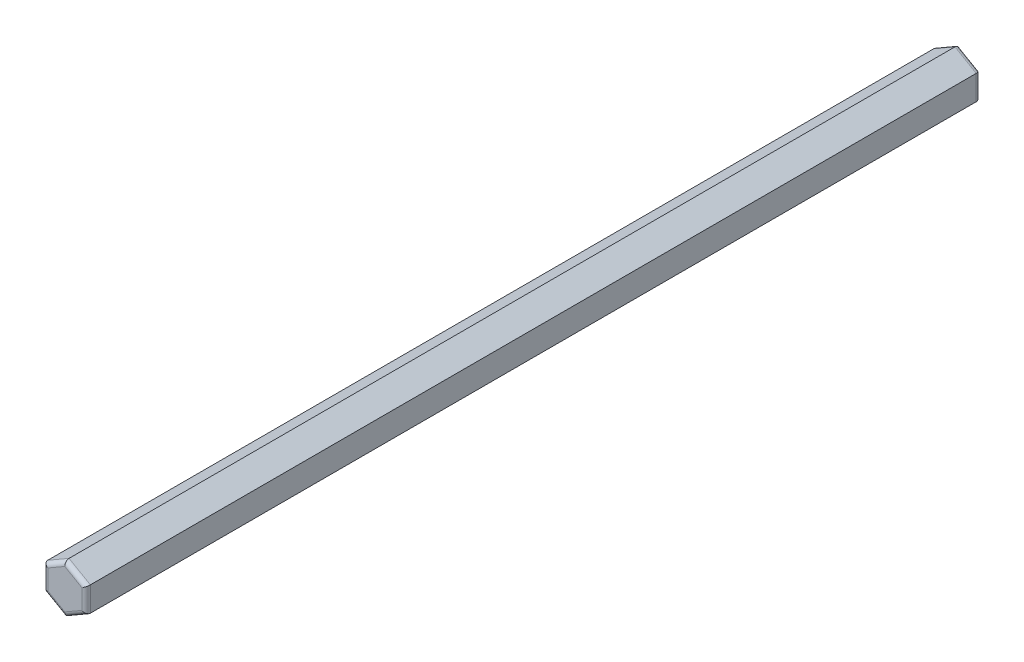
ISO-10303-21;
HEADER;
FILE_DESCRIPTION(('STEP AP214'),'2;1');
FILE_NAME('part.step','',(''),(''),'','','');
FILE_SCHEMA(('AUTOMOTIVE_DESIGN { 1 0 10303 214 1 1 1 1 }'));
ENDSEC;
DATA;
#1=APPLICATION_CONTEXT('core data for automotive mechanical design processes');
#2=APPLICATION_PROTOCOL_DEFINITION('international standard','automotive_design',2000,#1);
#3=PRODUCT_CONTEXT('',#1,'mechanical');
#4=PRODUCT('Part','Part','',(#3));
#5=PRODUCT_RELATED_PRODUCT_CATEGORY('part','',(#4));
#6=PRODUCT_DEFINITION_FORMATION('','',#4);
#7=PRODUCT_DEFINITION_CONTEXT('part definition',#1,'design');
#8=PRODUCT_DEFINITION('design','',#6,#7);
#9=PRODUCT_DEFINITION_SHAPE('','',#8);
#10=(LENGTH_UNIT() NAMED_UNIT(*) SI_UNIT(.MILLI.,.METRE.));
#11=(NAMED_UNIT(*) PLANE_ANGLE_UNIT() SI_UNIT($,.RADIAN.));
#12=(NAMED_UNIT(*) SI_UNIT($,.STERADIAN.) SOLID_ANGLE_UNIT());
#13=UNCERTAINTY_MEASURE_WITH_UNIT(LENGTH_MEASURE(1.E-05),#10,'distance_accuracy_value','');
#14=(GEOMETRIC_REPRESENTATION_CONTEXT(3) GLOBAL_UNCERTAINTY_ASSIGNED_CONTEXT((#13)) GLOBAL_UNIT_ASSIGNED_CONTEXT((#10,
#11,#12)) REPRESENTATION_CONTEXT('',''));
#15=CARTESIAN_POINT('',(0.,0.,0.));
#16=DIRECTION('',(0.,0.,1.));
#17=DIRECTION('',(1.,0.,0.));
#18=AXIS2_PLACEMENT_3D('',#15,#16,#17);
#19=CARTESIAN_POINT('',(-52.50212267549,1.44337567297407,30.));
#20=DIRECTION('',(0.5,0.866025403784439,0.));
#21=DIRECTION('',(-0.866025403784439,0.5,0.));
#22=AXIS2_PLACEMENT_3D('',#19,#20,#21);
#23=PLANE('',#22);
#24=DIRECTION('',(0.,0.,1.));
#25=VECTOR('',#24,1.);
#26=CARTESIAN_POINT('',(-55.00212267549,2.88675134594813,30.));
#27=LINE('',#26,#25);
#28=CARTESIAN_POINT('',(-55.00212267549,2.88675134594813,30.5));
#29=VERTEX_POINT('',#28);
#30=CARTESIAN_POINT('',(-55.00212267549,2.88675134594813,134.5));
#31=VERTEX_POINT('',#30);
#32=EDGE_CURVE('E153',#29,#31,#27,.T.);
#33=ORIENTED_EDGE('',*,*,#32,.T.);
#34=DIRECTION('',(-0.866025403784439,0.5,0.));
#35=VECTOR('',#34,1.);
#36=CARTESIAN_POINT('',(-52.50212267549,1.44337567297407,134.5));
#37=LINE('',#36,#35);
#38=CARTESIAN_POINT('',(-52.50212267549,1.44337567297407,134.5));
#39=VERTEX_POINT('',#38);
#40=EDGE_CURVE('E150',#31,#39,#37,.F.);
#41=ORIENTED_EDGE('',*,*,#40,.T.);
#42=DIRECTION('',(0.,0.,1.));
#43=VECTOR('',#42,1.);
#44=CARTESIAN_POINT('',(-52.50212267549,1.44337567297407,30.));
#45=LINE('',#44,#43);
#46=CARTESIAN_POINT('',(-52.50212267549,1.44337567297407,30.5));
#47=VERTEX_POINT('',#46);
#48=EDGE_CURVE('E147',#47,#39,#45,.T.);
#49=ORIENTED_EDGE('',*,*,#48,.F.);
#50=DIRECTION('',(-0.866025403784439,0.5,0.));
#51=VECTOR('',#50,1.);
#52=CARTESIAN_POINT('',(-55.00212267549,2.88675134594813,30.5));
#53=LINE('',#52,#51);
#54=EDGE_CURVE('E206',#47,#29,#53,.T.);
#55=ORIENTED_EDGE('',*,*,#54,.T.);
#56=EDGE_LOOP('',(#33,#41,#49,#55));
#57=FACE_BOUND('',#56,.T.);
#58=ADVANCED_FACE('F33',(#57),#23,.T.);
#59=CARTESIAN_POINT('',(-52.50212267549,-1.44337567297408,30.));
#60=DIRECTION('',(1.,0.,0.));
#61=DIRECTION('',(0.,0.,-1.));
#62=AXIS2_PLACEMENT_3D('',#59,#60,#61);
#63=PLANE('',#62);
#64=ORIENTED_EDGE('',*,*,#48,.T.);
#65=DIRECTION('',(0.,1.,0.));
#66=VECTOR('',#65,1.);
#67=CARTESIAN_POINT('',(-52.50212267549,-1.44337567297408,134.5));
#68=LINE('',#67,#66);
#69=CARTESIAN_POINT('',(-52.50212267549,-1.44337567297408,134.5));
#70=VERTEX_POINT('',#69);
#71=EDGE_CURVE('E191',#39,#70,#68,.F.);
#72=ORIENTED_EDGE('',*,*,#71,.T.);
#73=DIRECTION('',(0.,0.,1.));
#74=VECTOR('',#73,1.);
#75=CARTESIAN_POINT('',(-52.50212267549,-1.44337567297408,30.));
#76=LINE('',#75,#74);
#77=CARTESIAN_POINT('',(-52.50212267549,-1.44337567297408,30.5));
#78=VERTEX_POINT('',#77);
#79=EDGE_CURVE('E255',#78,#70,#76,.T.);
#80=ORIENTED_EDGE('',*,*,#79,.F.);
#81=DIRECTION('',(0.,1.,0.));
#82=VECTOR('',#81,1.);
#83=CARTESIAN_POINT('',(-52.50212267549,1.44337567297407,30.5));
#84=LINE('',#83,#82);
#85=EDGE_CURVE('E197',#78,#47,#84,.T.);
#86=ORIENTED_EDGE('',*,*,#85,.T.);
#87=EDGE_LOOP('',(#64,#72,#80,#86));
#88=FACE_BOUND('',#87,.T.);
#89=ADVANCED_FACE('F258',(#88),#63,.T.);
#90=CARTESIAN_POINT('',(-55.00212267549,-2.88675134594813,30.));
#91=DIRECTION('',(0.5,-0.866025403784439,0.));
#92=DIRECTION('',(0.866025403784439,0.5,0.));
#93=AXIS2_PLACEMENT_3D('',#90,#91,#92);
#94=PLANE('',#93);
#95=ORIENTED_EDGE('',*,*,#79,.T.);
#96=DIRECTION('',(0.866025403784439,0.5,0.));
#97=VECTOR('',#96,1.);
#98=CARTESIAN_POINT('',(-55.00212267549,-2.88675134594813,134.5));
#99=LINE('',#98,#97);
#100=CARTESIAN_POINT('',(-55.00212267549,-2.88675134594813,134.5));
#101=VERTEX_POINT('',#100);
#102=EDGE_CURVE('E231',#70,#101,#99,.F.);
#103=ORIENTED_EDGE('',*,*,#102,.T.);
#104=DIRECTION('',(0.,0.,1.));
#105=VECTOR('',#104,1.);
#106=CARTESIAN_POINT('',(-55.00212267549,-2.88675134594813,30.));
#107=LINE('',#106,#105);
#108=CARTESIAN_POINT('',(-55.00212267549,-2.88675134594813,30.5));
#109=VERTEX_POINT('',#108);
#110=EDGE_CURVE('E253',#109,#101,#107,.T.);
#111=ORIENTED_EDGE('',*,*,#110,.F.);
#112=DIRECTION('',(0.866025403784439,0.5,0.));
#113=VECTOR('',#112,1.);
#114=CARTESIAN_POINT('',(-52.50212267549,-1.44337567297408,30.5));
#115=LINE('',#114,#113);
#116=EDGE_CURVE('E234',#109,#78,#115,.T.);
#117=ORIENTED_EDGE('',*,*,#116,.T.);
#118=EDGE_LOOP('',(#95,#103,#111,#117));
#119=FACE_BOUND('',#118,.T.);
#120=ADVANCED_FACE('F269',(#119),#94,.T.);
#121=CARTESIAN_POINT('',(-57.50212267549,-1.44337567297406,30.));
#122=DIRECTION('',(-0.5,-0.866025403784438,0.));
#123=DIRECTION('',(0.866025403784438,-0.5,0.));
#124=AXIS2_PLACEMENT_3D('',#121,#122,#123);
#125=PLANE('',#124);
#126=ORIENTED_EDGE('',*,*,#110,.T.);
#127=DIRECTION('',(0.866025403784438,-0.5,0.));
#128=VECTOR('',#127,1.);
#129=CARTESIAN_POINT('',(-57.50212267549,-1.44337567297406,134.5));
#130=LINE('',#129,#128);
#131=CARTESIAN_POINT('',(-57.50212267549,-1.44337567297406,134.5));
#132=VERTEX_POINT('',#131);
#133=EDGE_CURVE('E201',#101,#132,#130,.F.);
#134=ORIENTED_EDGE('',*,*,#133,.T.);
#135=DIRECTION('',(0.,0.,1.));
#136=VECTOR('',#135,1.);
#137=CARTESIAN_POINT('',(-57.50212267549,-1.44337567297406,30.));
#138=LINE('',#137,#136);
#139=CARTESIAN_POINT('',(-57.50212267549,-1.44337567297406,30.5));
#140=VERTEX_POINT('',#139);
#141=EDGE_CURVE('E250',#140,#132,#138,.T.);
#142=ORIENTED_EDGE('',*,*,#141,.F.);
#143=DIRECTION('',(0.866025403784438,-0.5,0.));
#144=VECTOR('',#143,1.);
#145=CARTESIAN_POINT('',(-55.00212267549,-2.88675134594813,30.5));
#146=LINE('',#145,#144);
#147=EDGE_CURVE('E226',#140,#109,#146,.T.);
#148=ORIENTED_EDGE('',*,*,#147,.T.);
#149=EDGE_LOOP('',(#126,#134,#142,#148));
#150=FACE_BOUND('',#149,.T.);
#151=ADVANCED_FACE('F270',(#150),#125,.T.);
#152=CARTESIAN_POINT('',(-57.50212267549,1.44337567297406,30.));
#153=DIRECTION('',(-1.,0.,0.));
#154=DIRECTION('',(0.,0.,1.));
#155=AXIS2_PLACEMENT_3D('',#152,#153,#154);
#156=PLANE('',#155);
#157=ORIENTED_EDGE('',*,*,#141,.T.);
#158=DIRECTION('',(0.,-1.,0.));
#159=VECTOR('',#158,1.);
#160=CARTESIAN_POINT('',(-57.50212267549,1.44337567297406,134.5));
#161=LINE('',#160,#159);
#162=CARTESIAN_POINT('',(-57.50212267549,1.44337567297406,134.5));
#163=VERTEX_POINT('',#162);
#164=EDGE_CURVE('E199',#132,#163,#161,.F.);
#165=ORIENTED_EDGE('',*,*,#164,.T.);
#166=DIRECTION('',(0.,0.,1.));
#167=VECTOR('',#166,1.);
#168=CARTESIAN_POINT('',(-57.50212267549,1.44337567297406,30.));
#169=LINE('',#168,#167);
#170=CARTESIAN_POINT('',(-57.50212267549,1.44337567297406,30.5));
#171=VERTEX_POINT('',#170);
#172=EDGE_CURVE('E247',#171,#163,#169,.T.);
#173=ORIENTED_EDGE('',*,*,#172,.F.);
#174=DIRECTION('',(0.,-1.,0.));
#175=VECTOR('',#174,1.);
#176=CARTESIAN_POINT('',(-57.50212267549,-1.44337567297406,30.5));
#177=LINE('',#176,#175);
#178=EDGE_CURVE('E196',#171,#140,#177,.T.);
#179=ORIENTED_EDGE('',*,*,#178,.T.);
#180=EDGE_LOOP('',(#157,#165,#173,#179));
#181=FACE_BOUND('',#180,.T.);
#182=ADVANCED_FACE('F276',(#181),#156,.T.);
#183=CARTESIAN_POINT('',(-55.00212267549,2.88675134594813,30.));
#184=DIRECTION('',(-0.5,0.866025403784439,0.));
#185=DIRECTION('',(-0.866025403784439,-0.5,0.));
#186=AXIS2_PLACEMENT_3D('',#183,#184,#185);
#187=PLANE('',#186);
#188=ORIENTED_EDGE('',*,*,#172,.T.);
#189=DIRECTION('',(-0.866025403784439,-0.5,0.));
#190=VECTOR('',#189,1.);
#191=CARTESIAN_POINT('',(-55.00212267549,2.88675134594813,134.5));
#192=LINE('',#191,#190);
#193=EDGE_CURVE('E211',#163,#31,#192,.F.);
#194=ORIENTED_EDGE('',*,*,#193,.T.);
#195=ORIENTED_EDGE('',*,*,#32,.F.);
#196=DIRECTION('',(-0.866025403784439,-0.5,0.));
#197=VECTOR('',#196,1.);
#198=CARTESIAN_POINT('',(-57.50212267549,1.44337567297406,30.5));
#199=LINE('',#198,#197);
#200=EDGE_CURVE('E209',#29,#171,#199,.T.);
#201=ORIENTED_EDGE('',*,*,#200,.T.);
#202=EDGE_LOOP('',(#188,#194,#195,#201));
#203=FACE_BOUND('',#202,.T.);
#204=ADVANCED_FACE('F299',(#203),#187,.T.);
#205=CARTESIAN_POINT('',(0.,0.,30.));
#206=DIRECTION('',(0.,0.,1.));
#207=DIRECTION('',(1.,0.,0.));
#208=AXIS2_PLACEMENT_3D('',#205,#206,#207);
#209=PLANE('',#208);
#210=DIRECTION('',(0.,1.,0.));
#211=VECTOR('',#210,1.);
#212=CARTESIAN_POINT('',(-53.00212267549,-1.44337567297408,30.));
#213=LINE('',#212,#211);
#214=CARTESIAN_POINT('',(-53.00212267549,1.15470053837925,30.));
#215=VERTEX_POINT('',#214);
#216=CARTESIAN_POINT('',(-53.00212267549,-1.15470053837926,30.));
#217=VERTEX_POINT('',#216);
#218=EDGE_CURVE('E57',#215,#217,#213,.F.);
#219=ORIENTED_EDGE('',*,*,#218,.T.);
#220=DIRECTION('',(0.866025403784439,0.5,0.));
#221=VECTOR('',#220,1.);
#222=CARTESIAN_POINT('',(-55.25212267549,-2.45373864405591,30.));
#223=LINE('',#222,#221);
#224=CARTESIAN_POINT('',(-55.00212267549,-2.30940107675851,30.));
#225=VERTEX_POINT('',#224);
#226=EDGE_CURVE('E11',#217,#225,#223,.F.);
#227=ORIENTED_EDGE('',*,*,#226,.T.);
#228=DIRECTION('',(0.866025403784438,-0.5,0.));
#229=VECTOR('',#228,1.);
#230=CARTESIAN_POINT('',(-57.25212267549,-1.01036297108184,30.));
#231=LINE('',#230,#229);
#232=CARTESIAN_POINT('',(-57.00212267549,-1.15470053837925,30.));
#233=VERTEX_POINT('',#232);
#234=EDGE_CURVE('E42',#225,#233,#231,.F.);
#235=ORIENTED_EDGE('',*,*,#234,.T.);
#236=DIRECTION('',(0.,-1.,0.));
#237=VECTOR('',#236,1.);
#238=CARTESIAN_POINT('',(-57.00212267549,1.44337567297406,30.));
#239=LINE('',#238,#237);
#240=CARTESIAN_POINT('',(-57.00212267549,1.15470053837925,30.));
#241=VERTEX_POINT('',#240);
#242=EDGE_CURVE('E217',#233,#241,#239,.F.);
#243=ORIENTED_EDGE('',*,*,#242,.T.);
#244=DIRECTION('',(-0.866025403784439,-0.5,0.));
#245=VECTOR('',#244,1.);
#246=CARTESIAN_POINT('',(-54.75212267549,2.45373864405591,30.));
#247=LINE('',#246,#245);
#248=CARTESIAN_POINT('',(-55.00212267549,2.3094010767585,30.));
#249=VERTEX_POINT('',#248);
#250=EDGE_CURVE('E213',#241,#249,#247,.F.);
#251=ORIENTED_EDGE('',*,*,#250,.T.);
#252=DIRECTION('',(-0.866025403784439,0.5,0.));
#253=VECTOR('',#252,1.);
#254=CARTESIAN_POINT('',(-52.75212267549,1.01036297108185,30.));
#255=LINE('',#254,#253);
#256=EDGE_CURVE('E215',#249,#215,#255,.F.);
#257=ORIENTED_EDGE('',*,*,#256,.T.);
#258=EDGE_LOOP('',(#219,#227,#235,#243,#251,#257));
#259=FACE_BOUND('',#258,.T.);
#260=ADVANCED_FACE('F219',(#259),#209,.F.);
#261=CARTESIAN_POINT('',(0.,0.,135.));
#262=DIRECTION('',(0.,0.,1.));
#263=DIRECTION('',(1.,0.,0.));
#264=AXIS2_PLACEMENT_3D('',#261,#262,#263);
#265=PLANE('',#264);
#266=DIRECTION('',(0.866025403784438,-0.5,0.));
#267=VECTOR('',#266,1.);
#268=CARTESIAN_POINT('',(-14.7505306688725,-25.5486685570901,135.));
#269=LINE('',#268,#267);
#270=CARTESIAN_POINT('',(-57.00212267549,-1.15470053837926,135.));
#271=VERTEX_POINT('',#270);
#272=CARTESIAN_POINT('',(-55.00212267549,-2.30940107675851,135.));
#273=VERTEX_POINT('',#272);
#274=EDGE_CURVE('E241',#271,#273,#269,.T.);
#275=ORIENTED_EDGE('',*,*,#274,.T.);
#276=DIRECTION('',(0.866025403784439,0.5,0.));
#277=VECTOR('',#276,1.);
#278=CARTESIAN_POINT('',(-12.7505306688725,22.0845669419523,135.));
#279=LINE('',#278,#277);
#280=CARTESIAN_POINT('',(-53.00212267549,-1.15470053837926,135.));
#281=VERTEX_POINT('',#280);
#282=EDGE_CURVE('E239',#273,#281,#279,.T.);
#283=ORIENTED_EDGE('',*,*,#282,.T.);
#284=DIRECTION('',(0.,1.,0.));
#285=VECTOR('',#284,1.);
#286=CARTESIAN_POINT('',(-53.00212267549,0.,135.));
#287=LINE('',#286,#285);
#288=CARTESIAN_POINT('',(-53.00212267549,1.15470053837925,135.));
#289=VERTEX_POINT('',#288);
#290=EDGE_CURVE('E131',#281,#289,#287,.T.);
#291=ORIENTED_EDGE('',*,*,#290,.T.);
#292=DIRECTION('',(-0.866025403784439,0.5,0.));
#293=VECTOR('',#292,1.);
#294=CARTESIAN_POINT('',(-12.7505306688725,-22.0845669419524,135.));
#295=LINE('',#294,#293);
#296=CARTESIAN_POINT('',(-55.00212267549,2.3094010767585,135.));
#297=VERTEX_POINT('',#296);
#298=EDGE_CURVE('E124',#289,#297,#295,.T.);
#299=ORIENTED_EDGE('',*,*,#298,.T.);
#300=DIRECTION('',(-0.866025403784439,-0.5,0.));
#301=VECTOR('',#300,1.);
#302=CARTESIAN_POINT('',(-14.7505306688725,25.5486685570901,135.));
#303=LINE('',#302,#301);
#304=CARTESIAN_POINT('',(-57.00212267549,1.15470053837924,135.));
#305=VERTEX_POINT('',#304);
#306=EDGE_CURVE('E127',#297,#305,#303,.T.);
#307=ORIENTED_EDGE('',*,*,#306,.T.);
#308=DIRECTION('',(0.,-1.,0.));
#309=VECTOR('',#308,1.);
#310=CARTESIAN_POINT('',(-57.00212267549,0.,135.));
#311=LINE('',#310,#309);
#312=EDGE_CURVE('E136',#305,#271,#311,.T.);
#313=ORIENTED_EDGE('',*,*,#312,.T.);
#314=EDGE_LOOP('',(#275,#283,#291,#299,#307,#313));
#315=FACE_BOUND('',#314,.T.);
#316=ADVANCED_FACE('F126',(#315),#265,.T.);
#317=CARTESIAN_POINT('',(-14.7505306688725,25.5486685570901,134.5));
#318=DIRECTION('',(-0.866025403784439,-0.5,0.));
#319=DIRECTION('',(0.5,-0.866025403784439,0.));
#320=AXIS2_PLACEMENT_3D('',#317,#318,#319);
#321=CYLINDRICAL_SURFACE('',#320,0.5);
#322=CARTESIAN_POINT('',(-55.00212267549,2.3094010767585,134.5));
#323=DIRECTION('',(-1.,0.,0.));
#324=DIRECTION('',(0.,-1.,0.));
#325=AXIS2_PLACEMENT_3D('',#322,#323,#324);
#326=ELLIPSE('',#325,0.577350269189626,0.5);
#327=EDGE_CURVE('E142',#31,#297,#326,.F.);
#328=ORIENTED_EDGE('',*,*,#327,.F.);
#329=ORIENTED_EDGE('',*,*,#193,.F.);
#330=CARTESIAN_POINT('',(-57.00212267549,1.15470053837924,134.5));
#331=DIRECTION('',(-0.5,-0.866025403784439,0.));
#332=DIRECTION('',(-0.866025403784439,0.5,0.));
#333=AXIS2_PLACEMENT_3D('',#330,#331,#332);
#334=ELLIPSE('',#333,0.577350269189626,0.5);
#335=EDGE_CURVE('E145',#305,#163,#334,.T.);
#336=ORIENTED_EDGE('',*,*,#335,.F.);
#337=ORIENTED_EDGE('',*,*,#306,.F.);
#338=EDGE_LOOP('',(#328,#329,#336,#337));
#339=FACE_BOUND('',#338,.T.);
#340=ADVANCED_FACE('F140',(#339),#321,.T.);
#341=CARTESIAN_POINT('',(-57.00212267549,0.,134.5));
#342=DIRECTION('',(0.,-1.,0.));
#343=DIRECTION('',(0.,0.,-1.));
#344=AXIS2_PLACEMENT_3D('',#341,#342,#343);
#345=CYLINDRICAL_SURFACE('',#344,0.5);
#346=ORIENTED_EDGE('',*,*,#335,.T.);
#347=ORIENTED_EDGE('',*,*,#164,.F.);
#348=CARTESIAN_POINT('',(-57.00212267549,-1.15470053837925,134.5));
#349=DIRECTION('',(0.5,-0.866025403784439,0.));
#350=DIRECTION('',(-0.866025403784439,-0.5,0.));
#351=AXIS2_PLACEMENT_3D('',#348,#349,#350);
#352=ELLIPSE('',#351,0.577350269189626,0.5);
#353=EDGE_CURVE('E151',#271,#132,#352,.T.);
#354=ORIENTED_EDGE('',*,*,#353,.F.);
#355=ORIENTED_EDGE('',*,*,#312,.F.);
#356=EDGE_LOOP('',(#346,#347,#354,#355));
#357=FACE_BOUND('',#356,.T.);
#358=ADVANCED_FACE('F280',(#357),#345,.T.);
#359=CARTESIAN_POINT('',(-12.7505306688725,-22.0845669419524,134.5));
#360=DIRECTION('',(-0.866025403784439,0.5,0.));
#361=DIRECTION('',(-0.5,-0.866025403784439,0.));
#362=AXIS2_PLACEMENT_3D('',#359,#360,#361);
#363=CYLINDRICAL_SURFACE('',#362,0.5);
#364=ORIENTED_EDGE('',*,*,#327,.T.);
#365=ORIENTED_EDGE('',*,*,#298,.F.);
#366=CARTESIAN_POINT('',(-53.00212267549,1.15470053837925,134.5));
#367=DIRECTION('',(-0.5,0.866025403784439,0.));
#368=DIRECTION('',(-0.866025403784439,-0.5,0.));
#369=AXIS2_PLACEMENT_3D('',#366,#367,#368);
#370=ELLIPSE('',#369,0.577350269189626,0.5);
#371=EDGE_CURVE('E156',#39,#289,#370,.F.);
#372=ORIENTED_EDGE('',*,*,#371,.F.);
#373=ORIENTED_EDGE('',*,*,#40,.F.);
#374=EDGE_LOOP('',(#364,#365,#372,#373));
#375=FACE_BOUND('',#374,.T.);
#376=ADVANCED_FACE('F149',(#375),#363,.T.);
#377=CARTESIAN_POINT('',(-14.7505306688725,-25.5486685570901,134.5));
#378=DIRECTION('',(0.866025403784438,-0.5,0.));
#379=DIRECTION('',(0.5,0.866025403784438,0.));
#380=AXIS2_PLACEMENT_3D('',#377,#378,#379);
#381=CYLINDRICAL_SURFACE('',#380,0.5);
#382=ORIENTED_EDGE('',*,*,#353,.T.);
#383=ORIENTED_EDGE('',*,*,#133,.F.);
#384=CARTESIAN_POINT('',(-55.00212267549,-2.30940107675851,134.5));
#385=DIRECTION('',(1.,0.,0.));
#386=DIRECTION('',(0.,-1.,0.));
#387=AXIS2_PLACEMENT_3D('',#384,#385,#386);
#388=ELLIPSE('',#387,0.577350269189626,0.5);
#389=EDGE_CURVE('E180',#273,#101,#388,.T.);
#390=ORIENTED_EDGE('',*,*,#389,.F.);
#391=ORIENTED_EDGE('',*,*,#274,.F.);
#392=EDGE_LOOP('',(#382,#383,#390,#391));
#393=FACE_BOUND('',#392,.T.);
#394=ADVANCED_FACE('F282',(#393),#381,.T.);
#395=CARTESIAN_POINT('',(-53.00212267549,0.,134.5));
#396=DIRECTION('',(0.,1.,0.));
#397=DIRECTION('',(0.,0.,1.));
#398=AXIS2_PLACEMENT_3D('',#395,#396,#397);
#399=CYLINDRICAL_SURFACE('',#398,0.5);
#400=ORIENTED_EDGE('',*,*,#371,.T.);
#401=ORIENTED_EDGE('',*,*,#290,.F.);
#402=CARTESIAN_POINT('',(-53.00212267549,-1.15470053837927,134.5));
#403=DIRECTION('',(0.5,0.866025403784438,0.));
#404=DIRECTION('',(-0.866025403784439,0.5,0.));
#405=AXIS2_PLACEMENT_3D('',#402,#403,#404);
#406=ELLIPSE('',#405,0.577350269189626,0.5);
#407=EDGE_CURVE('E175',#70,#281,#406,.F.);
#408=ORIENTED_EDGE('',*,*,#407,.F.);
#409=ORIENTED_EDGE('',*,*,#71,.F.);
#410=EDGE_LOOP('',(#400,#401,#408,#409));
#411=FACE_BOUND('',#410,.T.);
#412=ADVANCED_FACE('F190',(#411),#399,.T.);
#413=CARTESIAN_POINT('',(-12.7505306688725,22.0845669419523,134.5));
#414=DIRECTION('',(0.866025403784439,0.5,0.));
#415=DIRECTION('',(-0.5,0.866025403784439,0.));
#416=AXIS2_PLACEMENT_3D('',#413,#414,#415);
#417=CYLINDRICAL_SURFACE('',#416,0.5);
#418=ORIENTED_EDGE('',*,*,#389,.T.);
#419=ORIENTED_EDGE('',*,*,#102,.F.);
#420=ORIENTED_EDGE('',*,*,#407,.T.);
#421=ORIENTED_EDGE('',*,*,#282,.F.);
#422=EDGE_LOOP('',(#418,#419,#420,#421));
#423=FACE_BOUND('',#422,.T.);
#424=ADVANCED_FACE('F283',(#423),#417,.T.);
#425=CARTESIAN_POINT('',(-54.75212267549,2.45373864405591,30.5));
#426=DIRECTION('',(0.866025403784439,0.5,0.));
#427=DIRECTION('',(-0.5,0.866025403784439,0.));
#428=AXIS2_PLACEMENT_3D('',#425,#426,#427);
#429=CYLINDRICAL_SURFACE('',#428,0.5);
#430=CARTESIAN_POINT('',(-55.00212267549,2.3094010767585,30.5));
#431=DIRECTION('',(1.,0.,0.));
#432=DIRECTION('',(0.,1.,0.));
#433=AXIS2_PLACEMENT_3D('',#430,#431,#432);
#434=ELLIPSE('',#433,0.577350269189626,0.5);
#435=EDGE_CURVE('E168',#249,#29,#434,.T.);
#436=ORIENTED_EDGE('',*,*,#435,.F.);
#437=ORIENTED_EDGE('',*,*,#250,.F.);
#438=CARTESIAN_POINT('',(-57.00212267549,1.15470053837925,30.5));
#439=DIRECTION('',(0.5,0.866025403784439,0.));
#440=DIRECTION('',(0.866025403784439,-0.5,0.));
#441=AXIS2_PLACEMENT_3D('',#438,#439,#440);
#442=ELLIPSE('',#441,0.577350269189626,0.5);
#443=EDGE_CURVE('E37',#171,#241,#442,.F.);
#444=ORIENTED_EDGE('',*,*,#443,.F.);
#445=ORIENTED_EDGE('',*,*,#200,.F.);
#446=EDGE_LOOP('',(#436,#437,#444,#445));
#447=FACE_BOUND('',#446,.T.);
#448=ADVANCED_FACE('F35',(#447),#429,.T.);
#449=CARTESIAN_POINT('',(-57.00212267549,1.44337567297406,30.5));
#450=DIRECTION('',(0.,1.,0.));
#451=DIRECTION('',(0.,0.,1.));
#452=AXIS2_PLACEMENT_3D('',#449,#450,#451);
#453=CYLINDRICAL_SURFACE('',#452,0.5);
#454=ORIENTED_EDGE('',*,*,#443,.T.);
#455=ORIENTED_EDGE('',*,*,#242,.F.);
#456=CARTESIAN_POINT('',(-57.00212267549,-1.15470053837925,30.5));
#457=DIRECTION('',(-0.5,0.866025403784439,0.));
#458=DIRECTION('',(0.866025403784439,0.5,0.));
#459=AXIS2_PLACEMENT_3D('',#456,#457,#458);
#460=ELLIPSE('',#459,0.577350269189626,0.5);
#461=EDGE_CURVE('E166',#140,#233,#460,.F.);
#462=ORIENTED_EDGE('',*,*,#461,.F.);
#463=ORIENTED_EDGE('',*,*,#178,.F.);
#464=EDGE_LOOP('',(#454,#455,#462,#463));
#465=FACE_BOUND('',#464,.T.);
#466=ADVANCED_FACE('F223',(#465),#453,.T.);
#467=CARTESIAN_POINT('',(-52.75212267549,1.01036297108185,30.5));
#468=DIRECTION('',(0.866025403784439,-0.5,0.));
#469=DIRECTION('',(0.5,0.866025403784439,0.));
#470=AXIS2_PLACEMENT_3D('',#467,#468,#469);
#471=CYLINDRICAL_SURFACE('',#470,0.5);
#472=ORIENTED_EDGE('',*,*,#435,.T.);
#473=ORIENTED_EDGE('',*,*,#54,.F.);
#474=CARTESIAN_POINT('',(-53.00212267549,1.15470053837925,30.5));
#475=DIRECTION('',(0.5,-0.866025403784439,0.));
#476=DIRECTION('',(0.866025403784439,0.5,0.));
#477=AXIS2_PLACEMENT_3D('',#474,#475,#476);
#478=ELLIPSE('',#477,0.577350269189626,0.5);
#479=EDGE_CURVE('E163',#215,#47,#478,.T.);
#480=ORIENTED_EDGE('',*,*,#479,.F.);
#481=ORIENTED_EDGE('',*,*,#256,.F.);
#482=EDGE_LOOP('',(#472,#473,#480,#481));
#483=FACE_BOUND('',#482,.T.);
#484=ADVANCED_FACE('F263',(#483),#471,.T.);
#485=CARTESIAN_POINT('',(-57.25212267549,-1.01036297108184,30.5));
#486=DIRECTION('',(-0.866025403784438,0.5,0.));
#487=DIRECTION('',(-0.5,-0.866025403784438,0.));
#488=AXIS2_PLACEMENT_3D('',#485,#486,#487);
#489=CYLINDRICAL_SURFACE('',#488,0.5);
#490=ORIENTED_EDGE('',*,*,#461,.T.);
#491=ORIENTED_EDGE('',*,*,#234,.F.);
#492=CARTESIAN_POINT('',(-55.00212267549,-2.30940107675851,30.5));
#493=DIRECTION('',(-1.,0.,0.));
#494=DIRECTION('',(0.,1.,0.));
#495=AXIS2_PLACEMENT_3D('',#492,#493,#494);
#496=ELLIPSE('',#495,0.577350269189626,0.5);
#497=EDGE_CURVE('E50',#109,#225,#496,.F.);
#498=ORIENTED_EDGE('',*,*,#497,.F.);
#499=ORIENTED_EDGE('',*,*,#147,.F.);
#500=EDGE_LOOP('',(#490,#491,#498,#499));
#501=FACE_BOUND('',#500,.T.);
#502=ADVANCED_FACE('F225',(#501),#489,.T.);
#503=CARTESIAN_POINT('',(-53.00212267549,-1.44337567297408,30.5));
#504=DIRECTION('',(0.,-1.,0.));
#505=DIRECTION('',(0.,0.,-1.));
#506=AXIS2_PLACEMENT_3D('',#503,#504,#505);
#507=CYLINDRICAL_SURFACE('',#506,0.5);
#508=ORIENTED_EDGE('',*,*,#479,.T.);
#509=ORIENTED_EDGE('',*,*,#85,.F.);
#510=CARTESIAN_POINT('',(-53.00212267549,-1.15470053837926,30.5));
#511=DIRECTION('',(-0.5,-0.866025403784438,0.));
#512=DIRECTION('',(0.866025403784439,-0.5,0.));
#513=AXIS2_PLACEMENT_3D('',#510,#511,#512);
#514=ELLIPSE('',#513,0.577350269189626,0.5);
#515=EDGE_CURVE('E160',#217,#78,#514,.T.);
#516=ORIENTED_EDGE('',*,*,#515,.F.);
#517=ORIENTED_EDGE('',*,*,#218,.F.);
#518=EDGE_LOOP('',(#508,#509,#516,#517));
#519=FACE_BOUND('',#518,.T.);
#520=ADVANCED_FACE('F265',(#519),#507,.T.);
#521=CARTESIAN_POINT('',(-55.25212267549,-2.45373864405591,30.5));
#522=DIRECTION('',(-0.866025403784439,-0.5,0.));
#523=DIRECTION('',(0.5,-0.866025403784439,0.));
#524=AXIS2_PLACEMENT_3D('',#521,#522,#523);
#525=CYLINDRICAL_SURFACE('',#524,0.5);
#526=ORIENTED_EDGE('',*,*,#497,.T.);
#527=ORIENTED_EDGE('',*,*,#226,.F.);
#528=ORIENTED_EDGE('',*,*,#515,.T.);
#529=ORIENTED_EDGE('',*,*,#116,.F.);
#530=EDGE_LOOP('',(#526,#527,#528,#529));
#531=FACE_BOUND('',#530,.T.);
#532=ADVANCED_FACE('F267',(#531),#525,.T.);
#533=CLOSED_SHELL('',(#58,#89,#120,#151,#182,#204,#260,#316,#340,#358,#376,#394,#412,#424,#448,
#466,#484,#502,#520,#532));
#534=MANIFOLD_SOLID_BREP('B2',#533);
#535=ADVANCED_BREP_SHAPE_REPRESENTATION('',(#18,#534),#14);
#536=SHAPE_DEFINITION_REPRESENTATION(#9,#535);
ENDSEC;
END-ISO-10303-21;
